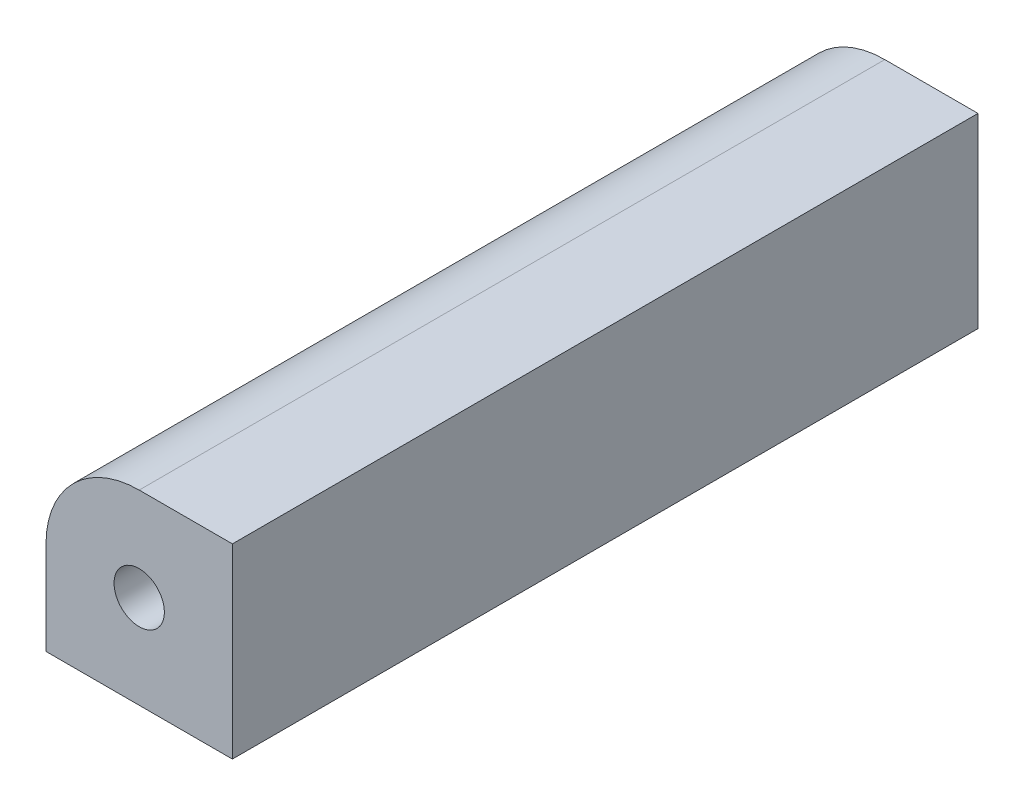
ISO-10303-21;
HEADER;
FILE_DESCRIPTION(('STEP AP214'),'2;1');
FILE_NAME('part.step','',(''),(''),'','','');
FILE_SCHEMA(('AUTOMOTIVE_DESIGN { 1 0 10303 214 1 1 1 1 }'));
ENDSEC;
DATA;
#1=APPLICATION_CONTEXT('core data for automotive mechanical design processes');
#2=APPLICATION_PROTOCOL_DEFINITION('international standard','automotive_design',2000,#1);
#3=PRODUCT_CONTEXT('',#1,'mechanical');
#4=PRODUCT('Part','Part','',(#3));
#5=PRODUCT_RELATED_PRODUCT_CATEGORY('part','',(#4));
#6=PRODUCT_DEFINITION_FORMATION('','',#4);
#7=PRODUCT_DEFINITION_CONTEXT('part definition',#1,'design');
#8=PRODUCT_DEFINITION('design','',#6,#7);
#9=PRODUCT_DEFINITION_SHAPE('','',#8);
#10=(LENGTH_UNIT() NAMED_UNIT(*) SI_UNIT(.MILLI.,.METRE.));
#11=(NAMED_UNIT(*) PLANE_ANGLE_UNIT() SI_UNIT($,.RADIAN.));
#12=(NAMED_UNIT(*) SI_UNIT($,.STERADIAN.) SOLID_ANGLE_UNIT());
#13=UNCERTAINTY_MEASURE_WITH_UNIT(LENGTH_MEASURE(1.E-05),#10,'distance_accuracy_value','');
#14=(GEOMETRIC_REPRESENTATION_CONTEXT(3) GLOBAL_UNCERTAINTY_ASSIGNED_CONTEXT((#13)) GLOBAL_UNIT_ASSIGNED_CONTEXT((#10,
#11,#12)) REPRESENTATION_CONTEXT('',''));
#15=CARTESIAN_POINT('',(0.,0.,0.));
#16=DIRECTION('',(0.,0.,1.));
#17=DIRECTION('',(1.,0.,0.));
#18=AXIS2_PLACEMENT_3D('',#15,#16,#17);
#19=CARTESIAN_POINT('',(69.0000000000003,-47.5000000000008,40.));
#20=DIRECTION('',(0.,0.,1.));
#21=DIRECTION('',(1.,0.,0.));
#22=AXIS2_PLACEMENT_3D('',#19,#20,#21);
#23=PLANE('',#22);
#24=CARTESIAN_POINT('',(69.0000000000003,-47.5000000000008,40.));
#25=DIRECTION('',(0.,0.,1.));
#26=DIRECTION('',(1.,0.,0.));
#27=AXIS2_PLACEMENT_3D('',#24,#25,#26);
#28=CIRCLE('',#27,5.);
#29=CARTESIAN_POINT('',(69.0000000000004,-42.5000000000008,40.));
#30=VERTEX_POINT('',#29);
#31=CARTESIAN_POINT('',(64.0000000000003,-47.5000000000009,40.));
#32=VERTEX_POINT('',#31);
#33=EDGE_CURVE('E126',#30,#32,#28,.T.);
#34=ORIENTED_EDGE('',*,*,#33,.T.);
#35=DIRECTION('',(0.,-1.,0.));
#36=VECTOR('',#35,1.);
#37=CARTESIAN_POINT('',(64.0000000000003,-47.5000000000009,40.));
#38=LINE('',#37,#36);
#39=CARTESIAN_POINT('',(64.0000000000002,-52.5000000000009,40.));
#40=VERTEX_POINT('',#39);
#41=EDGE_CURVE('E86',#32,#40,#38,.T.);
#42=ORIENTED_EDGE('',*,*,#41,.T.);
#43=DIRECTION('',(1.,0.,0.));
#44=VECTOR('',#43,1.);
#45=CARTESIAN_POINT('',(74.0000000000002,-52.5000000000009,40.));
#46=LINE('',#45,#44);
#47=CARTESIAN_POINT('',(74.0000000000002,-52.5000000000009,40.));
#48=VERTEX_POINT('',#47);
#49=EDGE_CURVE('E90',#40,#48,#46,.T.);
#50=ORIENTED_EDGE('',*,*,#49,.T.);
#51=DIRECTION('',(0.,1.,0.));
#52=VECTOR('',#51,1.);
#53=CARTESIAN_POINT('',(74.0000000000002,-42.5000000000009,40.));
#54=LINE('',#53,#52);
#55=CARTESIAN_POINT('',(74.0000000000002,-42.5000000000009,40.));
#56=VERTEX_POINT('',#55);
#57=EDGE_CURVE('E94',#48,#56,#54,.T.);
#58=ORIENTED_EDGE('',*,*,#57,.T.);
#59=DIRECTION('',(-1.,0.,0.));
#60=VECTOR('',#59,1.);
#61=CARTESIAN_POINT('',(69.0000000000004,-42.5000000000008,40.));
#62=LINE('',#61,#60);
#63=EDGE_CURVE('E52',#56,#30,#62,.T.);
#64=ORIENTED_EDGE('',*,*,#63,.T.);
#65=EDGE_LOOP('',(#34,#42,#50,#58,#64));
#66=FACE_BOUND('',#65,.T.);
#67=CARTESIAN_POINT('',(69.0000000000003,-47.5000000000008,40.));
#68=DIRECTION('',(0.,0.,1.));
#69=DIRECTION('',(1.,0.,0.));
#70=AXIS2_PLACEMENT_3D('',#67,#68,#69);
#71=CIRCLE('',#70,1.35000000000001);
#72=CARTESIAN_POINT('',(70.3500000000003,-47.5000000000008,40.));
#73=VERTEX_POINT('',#72);
#74=EDGE_CURVE('E120',#73,#73,#71,.T.);
#75=ORIENTED_EDGE('',*,*,#74,.F.);
#76=EDGE_LOOP('',(#75));
#77=FACE_BOUND('',#76,.T.);
#78=ADVANCED_FACE('F34',(#66,#77),#23,.T.);
#79=CARTESIAN_POINT('',(69.0000000000003,-47.5000000000008,0.));
#80=DIRECTION('',(0.,0.,1.));
#81=DIRECTION('',(1.,0.,0.));
#82=AXIS2_PLACEMENT_3D('',#79,#80,#81);
#83=PLANE('',#82);
#84=CARTESIAN_POINT('',(69.0000000000003,-47.5000000000008,0.));
#85=DIRECTION('',(0.,0.,1.));
#86=DIRECTION('',(1.,0.,0.));
#87=AXIS2_PLACEMENT_3D('',#84,#85,#86);
#88=CIRCLE('',#87,5.);
#89=CARTESIAN_POINT('',(69.0000000000004,-42.5000000000008,0.));
#90=VERTEX_POINT('',#89);
#91=CARTESIAN_POINT('',(64.0000000000003,-47.5000000000009,0.));
#92=VERTEX_POINT('',#91);
#93=EDGE_CURVE('E116',#90,#92,#88,.T.);
#94=ORIENTED_EDGE('',*,*,#93,.F.);
#95=DIRECTION('',(-1.,0.,0.));
#96=VECTOR('',#95,1.);
#97=CARTESIAN_POINT('',(69.0000000000004,-42.5000000000008,0.));
#98=LINE('',#97,#96);
#99=CARTESIAN_POINT('',(74.0000000000002,-42.5000000000009,0.));
#100=VERTEX_POINT('',#99);
#101=EDGE_CURVE('E78',#100,#90,#98,.T.);
#102=ORIENTED_EDGE('',*,*,#101,.F.);
#103=DIRECTION('',(0.,1.,0.));
#104=VECTOR('',#103,1.);
#105=CARTESIAN_POINT('',(74.0000000000002,-42.5000000000009,0.));
#106=LINE('',#105,#104);
#107=CARTESIAN_POINT('',(74.0000000000002,-52.5000000000009,0.));
#108=VERTEX_POINT('',#107);
#109=EDGE_CURVE('E72',#108,#100,#106,.T.);
#110=ORIENTED_EDGE('',*,*,#109,.F.);
#111=DIRECTION('',(1.,0.,0.));
#112=VECTOR('',#111,1.);
#113=CARTESIAN_POINT('',(74.0000000000002,-52.5000000000009,0.));
#114=LINE('',#113,#112);
#115=CARTESIAN_POINT('',(64.0000000000002,-52.5000000000009,0.));
#116=VERTEX_POINT('',#115);
#117=EDGE_CURVE('E102',#116,#108,#114,.T.);
#118=ORIENTED_EDGE('',*,*,#117,.F.);
#119=DIRECTION('',(0.,-1.,0.));
#120=VECTOR('',#119,1.);
#121=CARTESIAN_POINT('',(64.0000000000003,-47.5000000000009,0.));
#122=LINE('',#121,#120);
#123=EDGE_CURVE('E119',#92,#116,#122,.T.);
#124=ORIENTED_EDGE('',*,*,#123,.F.);
#125=EDGE_LOOP('',(#94,#102,#110,#118,#124));
#126=FACE_BOUND('',#125,.T.);
#127=CARTESIAN_POINT('',(69.0000000000003,-47.5000000000008,0.));
#128=DIRECTION('',(0.,0.,1.));
#129=DIRECTION('',(1.,0.,0.));
#130=AXIS2_PLACEMENT_3D('',#127,#128,#129);
#131=CIRCLE('',#130,1.35000000000001);
#132=CARTESIAN_POINT('',(70.3500000000003,-47.5000000000008,0.));
#133=VERTEX_POINT('',#132);
#134=EDGE_CURVE('E194',#133,#133,#131,.T.);
#135=ORIENTED_EDGE('',*,*,#134,.T.);
#136=EDGE_LOOP('',(#135));
#137=FACE_BOUND('',#136,.T.);
#138=ADVANCED_FACE('F134',(#126,#137),#83,.F.);
#139=CARTESIAN_POINT('',(69.0000000000003,-47.5000000000008,40.));
#140=DIRECTION('',(0.,0.,-1.));
#141=DIRECTION('',(-1.,0.,0.));
#142=AXIS2_PLACEMENT_3D('',#139,#140,#141);
#143=CYLINDRICAL_SURFACE('',#142,5.);
#144=ORIENTED_EDGE('',*,*,#93,.T.);
#145=DIRECTION('',(0.,0.,-1.));
#146=VECTOR('',#145,1.);
#147=CARTESIAN_POINT('',(64.0000000000003,-47.5000000000009,40.));
#148=LINE('',#147,#146);
#149=EDGE_CURVE('E11',#32,#92,#148,.T.);
#150=ORIENTED_EDGE('',*,*,#149,.F.);
#151=ORIENTED_EDGE('',*,*,#33,.F.);
#152=DIRECTION('',(0.,0.,-1.));
#153=VECTOR('',#152,1.);
#154=CARTESIAN_POINT('',(69.0000000000004,-42.5000000000008,40.));
#155=LINE('',#154,#153);
#156=EDGE_CURVE('E112',#30,#90,#155,.T.);
#157=ORIENTED_EDGE('',*,*,#156,.T.);
#158=EDGE_LOOP('',(#144,#150,#151,#157));
#159=FACE_BOUND('',#158,.T.);
#160=ADVANCED_FACE('F36',(#159),#143,.T.);
#161=CARTESIAN_POINT('',(64.0000000000003,-47.5000000000009,40.));
#162=DIRECTION('',(1.,0.,0.));
#163=DIRECTION('',(0.,1.,0.));
#164=AXIS2_PLACEMENT_3D('',#161,#162,#163);
#165=PLANE('',#164);
#166=ORIENTED_EDGE('',*,*,#123,.T.);
#167=DIRECTION('',(0.,0.,-1.));
#168=VECTOR('',#167,1.);
#169=CARTESIAN_POINT('',(64.0000000000002,-52.5000000000009,40.));
#170=LINE('',#169,#168);
#171=EDGE_CURVE('E44',#40,#116,#170,.T.);
#172=ORIENTED_EDGE('',*,*,#171,.F.);
#173=ORIENTED_EDGE('',*,*,#41,.F.);
#174=ORIENTED_EDGE('',*,*,#149,.T.);
#175=EDGE_LOOP('',(#166,#172,#173,#174));
#176=FACE_BOUND('',#175,.T.);
#177=ADVANCED_FACE('F158',(#176),#165,.F.);
#178=CARTESIAN_POINT('',(74.0000000000002,-52.5000000000009,40.));
#179=DIRECTION('',(0.,1.,0.));
#180=DIRECTION('',(0.,0.,1.));
#181=AXIS2_PLACEMENT_3D('',#178,#179,#180);
#182=PLANE('',#181);
#183=ORIENTED_EDGE('',*,*,#117,.T.);
#184=DIRECTION('',(0.,0.,-1.));
#185=VECTOR('',#184,1.);
#186=CARTESIAN_POINT('',(74.0000000000002,-52.5000000000009,40.));
#187=LINE('',#186,#185);
#188=EDGE_CURVE('E99',#48,#108,#187,.T.);
#189=ORIENTED_EDGE('',*,*,#188,.F.);
#190=ORIENTED_EDGE('',*,*,#49,.F.);
#191=ORIENTED_EDGE('',*,*,#171,.T.);
#192=EDGE_LOOP('',(#183,#189,#190,#191));
#193=FACE_BOUND('',#192,.T.);
#194=ADVANCED_FACE('F100',(#193),#182,.F.);
#195=CARTESIAN_POINT('',(74.0000000000002,-42.5000000000009,40.));
#196=DIRECTION('',(-1.,0.,0.));
#197=DIRECTION('',(0.,0.,1.));
#198=AXIS2_PLACEMENT_3D('',#195,#196,#197);
#199=PLANE('',#198);
#200=ORIENTED_EDGE('',*,*,#109,.T.);
#201=DIRECTION('',(0.,0.,-1.));
#202=VECTOR('',#201,1.);
#203=CARTESIAN_POINT('',(74.0000000000002,-42.5000000000009,40.));
#204=LINE('',#203,#202);
#205=EDGE_CURVE('E104',#56,#100,#204,.T.);
#206=ORIENTED_EDGE('',*,*,#205,.F.);
#207=ORIENTED_EDGE('',*,*,#57,.F.);
#208=ORIENTED_EDGE('',*,*,#188,.T.);
#209=EDGE_LOOP('',(#200,#206,#207,#208));
#210=FACE_BOUND('',#209,.T.);
#211=ADVANCED_FACE('F106',(#210),#199,.F.);
#212=CARTESIAN_POINT('',(69.0000000000004,-42.5000000000008,40.));
#213=DIRECTION('',(0.,-1.,0.));
#214=DIRECTION('',(1.,0.,0.));
#215=AXIS2_PLACEMENT_3D('',#212,#213,#214);
#216=PLANE('',#215);
#217=ORIENTED_EDGE('',*,*,#101,.T.);
#218=ORIENTED_EDGE('',*,*,#156,.F.);
#219=ORIENTED_EDGE('',*,*,#63,.F.);
#220=ORIENTED_EDGE('',*,*,#205,.T.);
#221=EDGE_LOOP('',(#217,#218,#219,#220));
#222=FACE_BOUND('',#221,.T.);
#223=ADVANCED_FACE('F139',(#222),#216,.F.);
#224=CARTESIAN_POINT('',(69.0000000000003,-47.5000000000008,40.));
#225=DIRECTION('',(0.,0.,-1.));
#226=DIRECTION('',(-1.,0.,0.));
#227=AXIS2_PLACEMENT_3D('',#224,#225,#226);
#228=CYLINDRICAL_SURFACE('',#227,1.35000000000001);
#229=ORIENTED_EDGE('',*,*,#74,.T.);
#230=EDGE_LOOP('',(#229));
#231=FACE_BOUND('',#230,.T.);
#232=ORIENTED_EDGE('',*,*,#134,.F.);
#233=EDGE_LOOP('',(#232));
#234=FACE_BOUND('',#233,.T.);
#235=ADVANCED_FACE('F141',(#231,#234),#228,.F.);
#236=CLOSED_SHELL('',(#78,#138,#160,#177,#194,#211,#223,#235));
#237=MANIFOLD_SOLID_BREP('B2',#236);
#238=ADVANCED_BREP_SHAPE_REPRESENTATION('',(#18,#237),#14);
#239=SHAPE_DEFINITION_REPRESENTATION(#9,#238);
ENDSEC;
END-ISO-10303-21;
